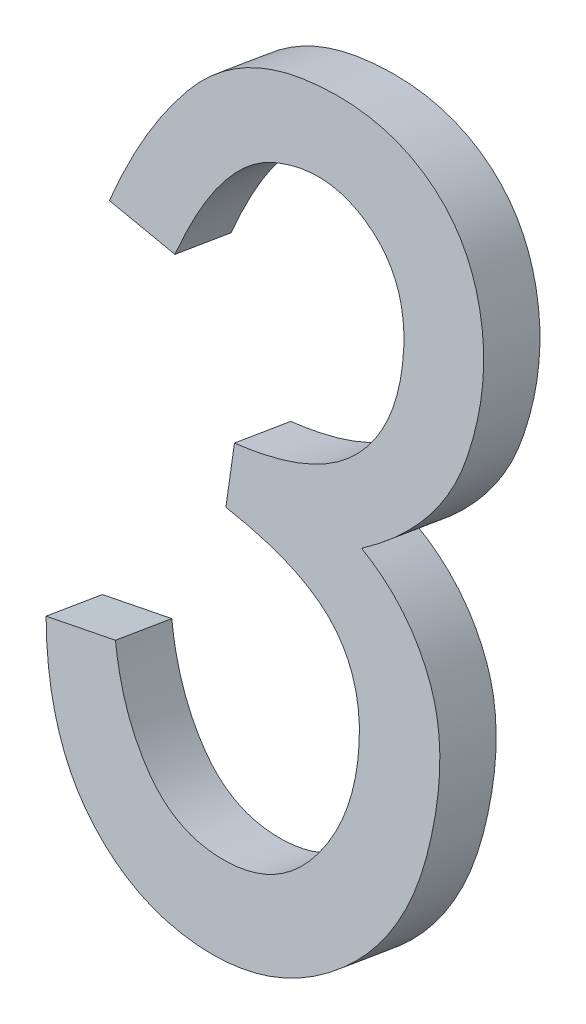
ISO-10303-21;
HEADER;
FILE_DESCRIPTION(('STEP AP214'),'2;1');
FILE_NAME('part.step','',(''),(''),'','','');
FILE_SCHEMA(('AUTOMOTIVE_DESIGN { 1 0 10303 214 1 1 1 1 }'));
ENDSEC;
DATA;
#1=APPLICATION_CONTEXT('core data for automotive mechanical design processes');
#2=APPLICATION_PROTOCOL_DEFINITION('international standard','automotive_design',2000,#1);
#3=PRODUCT_CONTEXT('',#1,'mechanical');
#4=PRODUCT('Part','Part','',(#3));
#5=PRODUCT_RELATED_PRODUCT_CATEGORY('part','',(#4));
#6=PRODUCT_DEFINITION_FORMATION('','',#4);
#7=PRODUCT_DEFINITION_CONTEXT('part definition',#1,'design');
#8=PRODUCT_DEFINITION('design','',#6,#7);
#9=PRODUCT_DEFINITION_SHAPE('','',#8);
#10=(LENGTH_UNIT() NAMED_UNIT(*) SI_UNIT(.MILLI.,.METRE.));
#11=(NAMED_UNIT(*) PLANE_ANGLE_UNIT() SI_UNIT($,.RADIAN.));
#12=(NAMED_UNIT(*) SI_UNIT($,.STERADIAN.) SOLID_ANGLE_UNIT());
#13=UNCERTAINTY_MEASURE_WITH_UNIT(LENGTH_MEASURE(1.E-05),#10,'distance_accuracy_value','');
#14=(GEOMETRIC_REPRESENTATION_CONTEXT(3) GLOBAL_UNCERTAINTY_ASSIGNED_CONTEXT((#13)) GLOBAL_UNIT_ASSIGNED_CONTEXT((#10,
#11,#12)) REPRESENTATION_CONTEXT('',''));
#15=CARTESIAN_POINT('',(0.,0.,0.));
#16=DIRECTION('',(0.,0.,1.));
#17=DIRECTION('',(1.,0.,0.));
#18=AXIS2_PLACEMENT_3D('',#15,#16,#17);
#19=CARTESIAN_POINT('',(1392.78076062639,1106.08482449074,1250.02724385002));
#20=DIRECTION('',(0.175427278405215,-0.971097313570585,0.161849552261763));
#21=DIRECTION('',(0.984071863203808,0.177771111406174,0.));
#22=AXIS2_PLACEMENT_3D('',#19,#20,#21);
#23=PLANE('',#22);
#24=CARTESIAN_POINT('',(1392.78076062639,1105.26282955422,1245.09527423086));
#25=CARTESIAN_POINT('',(1390.81208053691,1104.91680230621,1245.15294543886));
#26=CARTESIAN_POINT('',(1388.84340044742,1104.57077505821,1245.21061664686));
#27=CARTESIAN_POINT('',(1386.87472035794,1104.22474781021,1245.26828785486));
#28=B_SPLINE_CURVE_WITH_KNOTS('',3,(#24,#25,#26,#27),.UNSPECIFIED.,.F.,.F.,(4,4),(0.,
0.0175662127021156),.UNSPECIFIED.);
#29=CARTESIAN_POINT('',(1392.78076062639,1105.26282955422,1245.09527423086));
#30=VERTEX_POINT('',#29);
#31=CARTESIAN_POINT('',(1386.87472035794,1104.22474781021,1245.26828785486));
#32=VERTEX_POINT('',#31);
#33=EDGE_CURVE('E84',#30,#32,#28,.T.);
#34=ORIENTED_EDGE('',*,*,#33,.T.);
#35=DIRECTION('',(0.,-0.164398987305355,-0.986393923832144));
#36=VECTOR('',#35,1.);
#37=CARTESIAN_POINT('',(1386.87472035794,1105.04674274674,1250.20025747402));
#38=LINE('',#37,#36);
#39=CARTESIAN_POINT('',(1386.87472035794,1105.04674274674,1250.20025747402));
#40=VERTEX_POINT('',#39);
#41=EDGE_CURVE('E93',#40,#32,#38,.T.);
#42=ORIENTED_EDGE('',*,*,#41,.F.);
#43=CARTESIAN_POINT('',(1392.78076062639,1106.08482449074,1250.02724385002));
#44=CARTESIAN_POINT('',(1390.81208053691,1105.73879724274,1250.08491505802));
#45=CARTESIAN_POINT('',(1388.84340044742,1105.39276999474,1250.14258626602));
#46=CARTESIAN_POINT('',(1386.87472035794,1105.04674274674,1250.20025747402));
#47=B_SPLINE_CURVE_WITH_KNOTS('',3,(#43,#44,#45,#46),.UNSPECIFIED.,.F.,.F.,(4,4),(0.,
0.0175662127021156),.UNSPECIFIED.);
#48=CARTESIAN_POINT('',(1392.78076062639,1106.08482449074,1250.02724385002));
#49=VERTEX_POINT('',#48);
#50=EDGE_CURVE('E98',#49,#40,#47,.T.);
#51=ORIENTED_EDGE('',*,*,#50,.F.);
#52=DIRECTION('',(0.,-0.164398987305355,-0.986393923832144));
#53=VECTOR('',#52,1.);
#54=CARTESIAN_POINT('',(1392.78076062639,1106.08482449074,1250.02724385002));
#55=LINE('',#54,#53);
#56=EDGE_CURVE('E90',#49,#30,#55,.T.);
#57=ORIENTED_EDGE('',*,*,#56,.T.);
#58=EDGE_LOOP('',(#34,#42,#51,#57));
#59=FACE_BOUND('',#58,.T.);
#60=ADVANCED_FACE('F17',(#59),#23,.F.);
#61=CARTESIAN_POINT('',(1386.87472035794,1105.04674274674,1250.20025747402));
#62=CARTESIAN_POINT('',(1387.74832214765,1099.96014220113,1251.04802423162));
#63=CARTESIAN_POINT('',(1389.71700223713,1096.10626372652,1251.69033731073));
#64=CARTESIAN_POINT('',(1395.83800366941,1090.79175168737,1252.57608931725));
#65=CARTESIAN_POINT('',(1399.44966442953,1089.41063647771,1252.80627518553));
#66=CARTESIAN_POINT('',(1407.7673378076,1089.17706808531,1252.84520325093));
#67=CARTESIAN_POINT('',(1411.48322147651,1090.51359833071,1252.62244821003));
#68=CARTESIAN_POINT('',(1418.0361886271,1096.0473842992,1251.70015054861));
#69=CARTESIAN_POINT('',(1419.96085011185,1099.67466972153,1251.09560297822));
#70=CARTESIAN_POINT('',(1421.04379674541,1108.68146422314,1249.59447056129));
#71=CARTESIAN_POINT('',(1420.50223713646,1112.31331495476,1248.98916210602));
#72=CARTESIAN_POINT('',(1417.22616827828,1117.8464004907,1248.06698118336));
#73=CARTESIAN_POINT('',(1414.86689038031,1119.91726372957,1247.72183731022));
#74=CARTESIAN_POINT('',(1411.80313199105,1121.30569806218,1247.49043158812));
#75=B_SPLINE_CURVE_WITH_KNOTS('',3,(#61,#62,#63,#64,#65,#66,#67,#68,#69,#70,#71,#72,#73,#74),
.UNSPECIFIED.,.F.,.F.,(4,2,2,2,2,2,4),(0.0175662127021156,0.0568771996209321,0.0961045883383216,
0.135331977055711,0.174644532276662,0.213969619625543,0.253370119729836),.UNSPECIFIED.);
#76=DIRECTION('',(0.,-0.164398987305355,-0.986393923832144));
#77=VECTOR('',#76,1.);
#78=SURFACE_OF_LINEAR_EXTRUSION('',#75,#77);
#79=CARTESIAN_POINT('',(1386.87472035794,1104.22474781021,1245.26828785486));
#80=CARTESIAN_POINT('',(1387.74832214765,1099.1381472646,1246.11605461246));
#81=CARTESIAN_POINT('',(1389.71700223713,1095.28426878999,1246.75836769157));
#82=CARTESIAN_POINT('',(1395.83800366941,1089.96975675085,1247.64411969809));
#83=CARTESIAN_POINT('',(1399.44966442953,1088.58864154118,1247.87430556637));
#84=CARTESIAN_POINT('',(1407.7673378076,1088.35507314878,1247.91323363177));
#85=CARTESIAN_POINT('',(1411.48322147651,1089.69160339418,1247.69047859087));
#86=CARTESIAN_POINT('',(1418.0361886271,1095.22538936267,1246.76818092945));
#87=CARTESIAN_POINT('',(1419.96085011185,1098.852674785,1246.16363335906));
#88=CARTESIAN_POINT('',(1421.04379674541,1107.85946928661,1244.66250094213));
#89=CARTESIAN_POINT('',(1420.50223713646,1111.49132001823,1244.05719248686));
#90=CARTESIAN_POINT('',(1417.22616827828,1117.02440555417,1243.1350115642));
#91=CARTESIAN_POINT('',(1414.86689038031,1119.09526879305,1242.78986769106));
#92=CARTESIAN_POINT('',(1411.80313199105,1120.48370312565,1242.55846196896));
#93=B_SPLINE_CURVE_WITH_KNOTS('',3,(#79,#80,#81,#82,#83,#84,#85,#86,#87,#88,#89,#90,#91,#92),
.UNSPECIFIED.,.F.,.F.,(4,2,2,2,2,2,4),(0.0175662127021156,0.0568771996209321,0.0961045883383216,
0.135331977055711,0.174644532276662,0.213969619625543,0.253370119729836),.UNSPECIFIED.);
#94=CARTESIAN_POINT('',(1411.80313199105,1120.48370312565,1242.55846196896));
#95=VERTEX_POINT('',#94);
#96=EDGE_CURVE('E81',#32,#95,#93,.T.);
#97=ORIENTED_EDGE('',*,*,#96,.T.);
#98=DIRECTION('',(0.,-0.164398987305355,-0.986393923832144));
#99=VECTOR('',#98,1.);
#100=CARTESIAN_POINT('',(1411.80313199105,1121.30569806218,1247.49043158812));
#101=LINE('',#100,#99);
#102=CARTESIAN_POINT('',(1411.80313199105,1121.30569806218,1247.49043158812));
#103=VERTEX_POINT('',#102);
#104=EDGE_CURVE('E89',#103,#95,#101,.T.);
#105=ORIENTED_EDGE('',*,*,#104,.F.);
#106=EDGE_CURVE('E75',#40,#103,#75,.T.);
#107=ORIENTED_EDGE('',*,*,#106,.F.);
#108=ORIENTED_EDGE('',*,*,#41,.T.);
#109=EDGE_LOOP('',(#97,#105,#107,#108));
#110=FACE_BOUND('',#109,.T.);
#111=ADVANCED_FACE('F94',(#110),#78,.F.);
#112=CARTESIAN_POINT('',(1411.80313199105,1121.30569806218,1247.49043158812));
#113=CARTESIAN_POINT('',(1415.96196868009,1124.06959070558,1247.02978281422));
#114=CARTESIAN_POINT('',(1418.48434004474,1127.30062013379,1246.49127790952));
#115=CARTESIAN_POINT('',(1420.2286364745,1134.68464589702,1245.26060694898));
#116=CARTESIAN_POINT('',(1420.07158836689,1138.08369424961,1244.69409889021));
#117=CARTESIAN_POINT('',(1417.65995525727,1144.31218471363,1243.65601714621));
#118=CARTESIAN_POINT('',(1415.58053691275,1146.62191659403,1243.27106183281));
#119=CARTESIAN_POINT('',(1409.67984355881,1149.62962821312,1242.76977656296));
#120=CARTESIAN_POINT('',(1406.22930648769,1150.13841850184,1242.68497818151));
#121=CARTESIAN_POINT('',(1398.35304718786,1149.22991946426,1242.83639468777));
#122=CARTESIAN_POINT('',(1395.24161073825,1147.60809425083,1243.10669889001));
#123=CARTESIAN_POINT('',(1390.64626088828,1142.06212895884,1244.03102643867));
#124=CARTESIAN_POINT('',(1388.84340044742,1138.60273512161,1244.60759207821));
#125=CARTESIAN_POINT('',(1387.52684563758,1134.4504081456,1245.29964657421));
#126=B_SPLINE_CURVE_WITH_KNOTS('',3,(#112,#113,#114,#115,#116,#117,#118,#119,#120,#121,#122,
#123,#124,#125),.UNSPECIFIED.,.F.,.F.,(4,2,2,2,2,2,4),(0.253370119729836,0.295050686413116,
0.336592549574333,0.378134412735547,0.419601057719732,0.461083910201908,0.502450658409047),.UNSPECIFIED.);
#127=DIRECTION('',(0.,-0.164398987305355,-0.986393923832144));
#128=VECTOR('',#127,1.);
#129=SURFACE_OF_LINEAR_EXTRUSION('',#126,#128);
#130=CARTESIAN_POINT('',(1411.80313199105,1120.48370312565,1242.55846196896));
#131=CARTESIAN_POINT('',(1415.96196868009,1123.24759576905,1242.09781319506));
#132=CARTESIAN_POINT('',(1418.48434004474,1126.47862519726,1241.55930829035));
#133=CARTESIAN_POINT('',(1420.2286364745,1133.86265096049,1240.32863732982));
#134=CARTESIAN_POINT('',(1420.07158836689,1137.26169931309,1239.76212927105));
#135=CARTESIAN_POINT('',(1417.65995525727,1143.4901897771,1238.72404752705));
#136=CARTESIAN_POINT('',(1415.58053691275,1145.7999216575,1238.33909221365));
#137=CARTESIAN_POINT('',(1409.67984355881,1148.8076332766,1237.8378069438));
#138=CARTESIAN_POINT('',(1406.22930648769,1149.31642356531,1237.75300856235));
#139=CARTESIAN_POINT('',(1398.35304718786,1148.40792452773,1237.90442506861));
#140=CARTESIAN_POINT('',(1395.24161073825,1146.78609931431,1238.17472927085));
#141=CARTESIAN_POINT('',(1390.64626088828,1141.24013402231,1239.09905681951));
#142=CARTESIAN_POINT('',(1388.84340044742,1137.78074018509,1239.67562245905));
#143=CARTESIAN_POINT('',(1387.52684563758,1133.62841320908,1240.36767695505));
#144=B_SPLINE_CURVE_WITH_KNOTS('',3,(#130,#131,#132,#133,#134,#135,#136,#137,#138,#139,#140,
#141,#142,#143),.UNSPECIFIED.,.F.,.F.,(4,2,2,2,2,2,4),(0.253370119729836,0.295050686413116,
0.336592549574333,0.378134412735547,0.419601057719732,0.461083910201908,0.502450658409047),.UNSPECIFIED.);
#145=CARTESIAN_POINT('',(1387.52684563758,1133.62841320908,1240.36767695505));
#146=VERTEX_POINT('',#145);
#147=EDGE_CURVE('E86',#95,#146,#144,.T.);
#148=ORIENTED_EDGE('',*,*,#147,.T.);
#149=DIRECTION('',(0.,-0.164398987305355,-0.986393923832144));
#150=VECTOR('',#149,1.);
#151=CARTESIAN_POINT('',(1387.52684563758,1134.4504081456,1245.29964657421));
#152=LINE('',#151,#150);
#153=CARTESIAN_POINT('',(1387.52684563758,1134.4504081456,1245.29964657421));
#154=VERTEX_POINT('',#153);
#155=EDGE_CURVE('E226',#154,#146,#152,.T.);
#156=ORIENTED_EDGE('',*,*,#155,.F.);
#157=EDGE_CURVE('E216',#103,#154,#126,.T.);
#158=ORIENTED_EDGE('',*,*,#157,.F.);
#159=ORIENTED_EDGE('',*,*,#104,.T.);
#160=EDGE_LOOP('',(#148,#156,#158,#159));
#161=FACE_BOUND('',#160,.T.);
#162=ADVANCED_FACE('F150',(#161),#129,.F.);
#163=CARTESIAN_POINT('',(1387.52684563758,1134.4504081456,1245.29964657421));
#164=DIRECTION('',(0.175427278405214,0.971097313570585,-0.161849552261763));
#165=DIRECTION('',(-0.984071863203808,0.177771111406173,0.));
#166=AXIS2_PLACEMENT_3D('',#163,#164,#165);
#167=PLANE('',#166);
#168=CARTESIAN_POINT('',(1387.52684563758,1133.62841320908,1240.36767695505));
#169=CARTESIAN_POINT('',(1389.49552572707,1133.28238596108,1240.42534816305));
#170=CARTESIAN_POINT('',(1391.46420581655,1132.93635871308,1240.48301937105));
#171=CARTESIAN_POINT('',(1393.43288590604,1132.59033146508,1240.54069057905));
#172=B_SPLINE_CURVE_WITH_KNOTS('',3,(#168,#169,#170,#171),.UNSPECIFIED.,.F.,.F.,(4,4),
(0.502450658409047,0.523472407633577),.UNSPECIFIED.);
#173=CARTESIAN_POINT('',(1393.43288590604,1132.59033146508,1240.54069057905));
#174=VERTEX_POINT('',#173);
#175=EDGE_CURVE('E213',#146,#174,#172,.T.);
#176=ORIENTED_EDGE('',*,*,#175,.T.);
#177=DIRECTION('',(0.,-0.164398987305355,-0.986393923832144));
#178=VECTOR('',#177,1.);
#179=CARTESIAN_POINT('',(1393.43288590604,1133.4123264016,1245.47266019821));
#180=LINE('',#179,#178);
#181=CARTESIAN_POINT('',(1393.43288590604,1133.4123264016,1245.47266019821));
#182=VERTEX_POINT('',#181);
#183=EDGE_CURVE('E202',#182,#174,#180,.T.);
#184=ORIENTED_EDGE('',*,*,#183,.F.);
#185=CARTESIAN_POINT('',(1387.52684563758,1134.4504081456,1245.29964657421));
#186=CARTESIAN_POINT('',(1389.49552572707,1134.1043808976,1245.35731778221));
#187=CARTESIAN_POINT('',(1391.46420581655,1133.7583536496,1245.41498899021));
#188=CARTESIAN_POINT('',(1393.43288590604,1133.4123264016,1245.47266019821));
#189=B_SPLINE_CURVE_WITH_KNOTS('',3,(#185,#186,#187,#188),.UNSPECIFIED.,.F.,.F.,(4,4),
(0.502450658409047,0.523472407633577),.UNSPECIFIED.);
#190=EDGE_CURVE('E192',#154,#182,#189,.T.);
#191=ORIENTED_EDGE('',*,*,#190,.F.);
#192=ORIENTED_EDGE('',*,*,#155,.T.);
#193=EDGE_LOOP('',(#176,#184,#191,#192));
#194=FACE_BOUND('',#193,.T.);
#195=ADVANCED_FACE('F153',(#194),#167,.F.);
#196=CARTESIAN_POINT('',(1393.43288590604,1133.4123264016,1245.47266019821));
#197=CARTESIAN_POINT('',(1395.18008948546,1138.71951931781,1244.58812804551));
#198=CARTESIAN_POINT('',(1397.53020134228,1141.95054874602,1244.04962314081));
#199=CARTESIAN_POINT('',(1403.43624161073,1144.26028062643,1243.66466782741));
#200=CARTESIAN_POINT('',(1406.22930648769,1144.09159234303,1243.69278254131));
#201=CARTESIAN_POINT('',(1411.48011164642,1141.07587461398,1244.19540216282));
#202=CARTESIAN_POINT('',(1412.89821029082,1138.66761523061,1244.59677872671));
#203=CARTESIAN_POINT('',(1413.34116331096,1131.9719879818,1245.71271660151));
#204=CARTESIAN_POINT('',(1412.40604026845,1129.25999942559,1246.16471469421));
#205=CARTESIAN_POINT('',(1408.2532719386,1125.11373131014,1246.85575938012));
#206=CARTESIAN_POINT('',(1404.91275167785,1123.84899833498,1247.06654820932));
#207=CARTESIAN_POINT('',(1400.32326621924,1123.38186155018,1247.14440434012));
#208=B_SPLINE_CURVE_WITH_KNOTS('',3,(#196,#197,#198,#199,#200,#201,#202,#203,#204,#205,#206,
#207),.UNSPECIFIED.,.F.,.F.,(4,2,2,2,2,4),(0.523472407633577,0.567178731359308,
0.610885055085039,0.654744711188057,0.698604367291071,0.742336027915054),.UNSPECIFIED.);
#209=DIRECTION('',(0.,-0.164398987305355,-0.986393923832144));
#210=VECTOR('',#209,1.);
#211=SURFACE_OF_LINEAR_EXTRUSION('',#208,#210);
#212=CARTESIAN_POINT('',(1393.43288590604,1132.59033146508,1240.54069057905));
#213=CARTESIAN_POINT('',(1395.18008948546,1137.89752438129,1239.65615842635));
#214=CARTESIAN_POINT('',(1397.53020134228,1141.12855380949,1239.11765352165));
#215=CARTESIAN_POINT('',(1403.43624161073,1143.4382856899,1238.73269820825));
#216=CARTESIAN_POINT('',(1406.22930648769,1143.2695974065,1238.76081292215));
#217=CARTESIAN_POINT('',(1411.48011164642,1140.25387967745,1239.26343254366));
#218=CARTESIAN_POINT('',(1412.89821029082,1137.84562029409,1239.66480910755));
#219=CARTESIAN_POINT('',(1413.34116331096,1131.14999304527,1240.78074698235));
#220=CARTESIAN_POINT('',(1412.40604026845,1128.43800448907,1241.23274507505));
#221=CARTESIAN_POINT('',(1408.2532719386,1124.29173637361,1241.92378976096));
#222=CARTESIAN_POINT('',(1404.91275167785,1123.02700339845,1242.13457859016));
#223=CARTESIAN_POINT('',(1400.32326621924,1122.55986661365,1242.21243472096));
#224=B_SPLINE_CURVE_WITH_KNOTS('',3,(#212,#213,#214,#215,#216,#217,#218,#219,#220,#221,#222,
#223),.UNSPECIFIED.,.F.,.F.,(4,2,2,2,2,4),(0.523472407633577,0.567178731359308,
0.610885055085039,0.654744711188057,0.698604367291071,0.742336027915054),.UNSPECIFIED.);
#225=CARTESIAN_POINT('',(1400.32326621924,1122.55986661365,1242.21243472096));
#226=VERTEX_POINT('',#225);
#227=EDGE_CURVE('E189',#174,#226,#224,.T.);
#228=ORIENTED_EDGE('',*,*,#227,.T.);
#229=DIRECTION('',(0.,-0.164398987305355,-0.986393923832144));
#230=VECTOR('',#229,1.);
#231=CARTESIAN_POINT('',(1400.32326621924,1123.38186155018,1247.14440434012));
#232=LINE('',#231,#230);
#233=CARTESIAN_POINT('',(1400.32326621924,1123.38186155018,1247.14440434012));
#234=VERTEX_POINT('',#233);
#235=EDGE_CURVE('E181',#234,#226,#232,.T.);
#236=ORIENTED_EDGE('',*,*,#235,.F.);
#237=EDGE_CURVE('E176',#182,#234,#208,.T.);
#238=ORIENTED_EDGE('',*,*,#237,.F.);
#239=ORIENTED_EDGE('',*,*,#183,.T.);
#240=EDGE_LOOP('',(#228,#236,#238,#239));
#241=FACE_BOUND('',#240,.T.);
#242=ADVANCED_FACE('F157',(#241),#211,.F.);
#243=CARTESIAN_POINT('',(1400.32326621924,1123.38186155018,1247.14440434012));
#244=DIRECTION('',(1.,0.,0.));
#245=DIRECTION('',(0.,1.,0.));
#246=AXIS2_PLACEMENT_3D('',#243,#244,#245);
#247=PLANE('',#246);
#248=CARTESIAN_POINT('',(1400.32326621924,1122.55986661365,1242.21243472096));
#249=CARTESIAN_POINT('',(1400.32326621924,1121.05897342545,1242.46258358566));
#250=CARTESIAN_POINT('',(1400.32326621924,1119.55808023725,1242.71273245036));
#251=CARTESIAN_POINT('',(1400.32326621924,1118.05718704904,1242.96288131506));
#252=B_SPLINE_CURVE_WITH_KNOTS('',3,(#248,#249,#250,#251),.UNSPECIFIED.,.F.,.F.,(4,4),
(0.742336027915054,0.75933143255657),.UNSPECIFIED.);
#253=CARTESIAN_POINT('',(1400.32326621924,1118.05718704904,1242.96288131506));
#254=VERTEX_POINT('',#253);
#255=EDGE_CURVE('E180',#226,#254,#252,.T.);
#256=ORIENTED_EDGE('',*,*,#255,.T.);
#257=DIRECTION('',(0.,-0.164398987305355,-0.986393923832144));
#258=VECTOR('',#257,1.);
#259=CARTESIAN_POINT('',(1400.32326621924,1118.87918198557,1247.89485093422));
#260=LINE('',#259,#258);
#261=CARTESIAN_POINT('',(1400.32326621924,1118.87918198557,1247.89485093422));
#262=VERTEX_POINT('',#261);
#263=EDGE_CURVE('E242',#262,#254,#260,.T.);
#264=ORIENTED_EDGE('',*,*,#263,.F.);
#265=CARTESIAN_POINT('',(1400.32326621924,1123.38186155018,1247.14440434012));
#266=CARTESIAN_POINT('',(1400.32326621924,1121.88096836198,1247.39455320482));
#267=CARTESIAN_POINT('',(1400.32326621924,1120.38007517377,1247.64470206952));
#268=CARTESIAN_POINT('',(1400.32326621924,1118.87918198557,1247.89485093422));
#269=B_SPLINE_CURVE_WITH_KNOTS('',3,(#265,#266,#267,#268),.UNSPECIFIED.,.F.,.F.,(4,4),
(0.742336027915054,0.75933143255657),.UNSPECIFIED.);
#270=EDGE_CURVE('E38',#234,#262,#269,.T.);
#271=ORIENTED_EDGE('',*,*,#270,.F.);
#272=ORIENTED_EDGE('',*,*,#235,.T.);
#273=EDGE_LOOP('',(#256,#264,#271,#272));
#274=FACE_BOUND('',#273,.T.);
#275=ADVANCED_FACE('F161',(#274),#247,.F.);
#276=CARTESIAN_POINT('',(1400.32326621924,1118.87918198557,1247.89485093422));
#277=CARTESIAN_POINT('',(1404.91275167785,1118.19145283017,1248.00947246012));
#278=CARTESIAN_POINT('',(1408.25950782997,1116.98468280277,1248.21060079802));
#279=CARTESIAN_POINT('',(1412.39441013857,1113.5065419127,1248.79029094636));
#280=CARTESIAN_POINT('',(1413.56263982103,1111.09356890555,1249.19245311422));
#281=CARTESIAN_POINT('',(1413.98103968627,1104.86425442338,1250.23067219458));
#282=CARTESIAN_POINT('',(1413.23042505593,1102.10118579813,1250.69118363212));
#283=CARTESIAN_POINT('',(1409.74222275874,1097.25677095588,1251.49858610583));
#284=CARTESIAN_POINT('',(1407.37360178971,1095.98947953032,1251.70980134343));
#285=CARTESIAN_POINT('',(1401.46756152125,1095.75591113792,1251.74872940883));
#286=CARTESIAN_POINT('',(1399.00671140939,1096.67720868572,1251.59517981753));
#287=CARTESIAN_POINT('',(1395.06935123042,1100.59596726933,1250.94205338692));
#288=CARTESIAN_POINT('',(1393.6543624161,1103.07438743314,1250.52898335962));
#289=CARTESIAN_POINT('',(1392.78076062639,1106.08482449074,1250.02724385002));
#290=B_SPLINE_CURVE_WITH_KNOTS('',3,(#276,#277,#278,#279,#280,#281,#282,#283,#284,#285,#286,
#287,#288,#289),.UNSPECIFIED.,.F.,.F.,(4,2,2,2,2,2,4),(0.75933143255657,0.799496218776918,
0.839674103409554,0.879862618966938,0.919908412644625,0.959954206322311,1.),.UNSPECIFIED.);
#291=DIRECTION('',(0.,-0.164398987305355,-0.986393923832144));
#292=VECTOR('',#291,1.);
#293=SURFACE_OF_LINEAR_EXTRUSION('',#290,#292);
#294=CARTESIAN_POINT('',(1400.32326621924,1118.05718704904,1242.96288131506));
#295=CARTESIAN_POINT('',(1404.91275167785,1117.36945789364,1243.07750284096));
#296=CARTESIAN_POINT('',(1408.25950782997,1116.16268786624,1243.27863117886));
#297=CARTESIAN_POINT('',(1412.39441013857,1112.68454697617,1243.8583213272));
#298=CARTESIAN_POINT('',(1413.56263982103,1110.27157396903,1244.26048349506));
#299=CARTESIAN_POINT('',(1413.98103968627,1104.04225948685,1245.29870257542));
#300=CARTESIAN_POINT('',(1413.23042505593,1101.27919086161,1245.75921401296));
#301=CARTESIAN_POINT('',(1409.74222275874,1096.43477601936,1246.56661648667));
#302=CARTESIAN_POINT('',(1407.37360178971,1095.16748459379,1246.77783172427));
#303=CARTESIAN_POINT('',(1401.46756152125,1094.93391620139,1246.81675978967));
#304=CARTESIAN_POINT('',(1399.00671140939,1095.8552137492,1246.66321019837));
#305=CARTESIAN_POINT('',(1395.06935123042,1099.7739723328,1246.01008376776));
#306=CARTESIAN_POINT('',(1393.6543624161,1102.25239249661,1245.59701374046));
#307=CARTESIAN_POINT('',(1392.78076062639,1105.26282955422,1245.09527423086));
#308=B_SPLINE_CURVE_WITH_KNOTS('',3,(#294,#295,#296,#297,#298,#299,#300,#301,#302,#303,#304,
#305,#306,#307),.UNSPECIFIED.,.F.,.F.,(4,2,2,2,2,2,4),(0.75933143255657,0.799496218776918,
0.839674103409554,0.879862618966938,0.919908412644625,0.959954206322311,1.),.UNSPECIFIED.);
#309=EDGE_CURVE('E30',#254,#30,#308,.T.);
#310=ORIENTED_EDGE('',*,*,#309,.T.);
#311=ORIENTED_EDGE('',*,*,#56,.F.);
#312=EDGE_CURVE('E11',#262,#49,#290,.T.);
#313=ORIENTED_EDGE('',*,*,#312,.F.);
#314=ORIENTED_EDGE('',*,*,#263,.T.);
#315=EDGE_LOOP('',(#310,#311,#313,#314));
#316=FACE_BOUND('',#315,.T.);
#317=ADVANCED_FACE('F272',(#316),#293,.F.);
#318=CARTESIAN_POINT('',(1414.79019208574,1093.30630878822,1252.15699646711));
#319=DIRECTION('',(0.,-0.164398987305383,-0.986393923832139));
#320=DIRECTION('',(0.,0.986393923832139,-0.164398987305383));
#321=AXIS2_PLACEMENT_3D('',#318,#319,#320);
#322=PLANE('',#321);
#323=ORIENTED_EDGE('',*,*,#50,.T.);
#324=ORIENTED_EDGE('',*,*,#106,.T.);
#325=ORIENTED_EDGE('',*,*,#157,.T.);
#326=ORIENTED_EDGE('',*,*,#190,.T.);
#327=ORIENTED_EDGE('',*,*,#237,.T.);
#328=ORIENTED_EDGE('',*,*,#270,.T.);
#329=ORIENTED_EDGE('',*,*,#312,.T.);
#330=EDGE_LOOP('',(#323,#324,#325,#326,#327,#328,#329));
#331=FACE_BOUND('',#330,.T.);
#332=ADVANCED_FACE('F327',(#331),#322,.F.);
#333=CARTESIAN_POINT('',(1414.79019208574,1092.4843138517,1247.22502684795));
#334=DIRECTION('',(0.,-0.164398987305383,-0.986393923832139));
#335=DIRECTION('',(0.,0.986393923832139,-0.164398987305383));
#336=AXIS2_PLACEMENT_3D('',#333,#334,#335);
#337=PLANE('',#336);
#338=ORIENTED_EDGE('',*,*,#33,.F.);
#339=ORIENTED_EDGE('',*,*,#309,.F.);
#340=ORIENTED_EDGE('',*,*,#255,.F.);
#341=ORIENTED_EDGE('',*,*,#227,.F.);
#342=ORIENTED_EDGE('',*,*,#175,.F.);
#343=ORIENTED_EDGE('',*,*,#147,.F.);
#344=ORIENTED_EDGE('',*,*,#96,.F.);
#345=EDGE_LOOP('',(#338,#339,#340,#341,#342,#343,#344));
#346=FACE_BOUND('',#345,.T.);
#347=ADVANCED_FACE('F19',(#346),#337,.T.);
#348=CLOSED_SHELL('',(#60,#111,#162,#195,#242,#275,#317,#332,#347));
#349=MANIFOLD_SOLID_BREP('B1',#348);
#350=ADVANCED_BREP_SHAPE_REPRESENTATION('',(#18,#349),#14);
#351=SHAPE_DEFINITION_REPRESENTATION(#9,#350);
ENDSEC;
END-ISO-10303-21;
